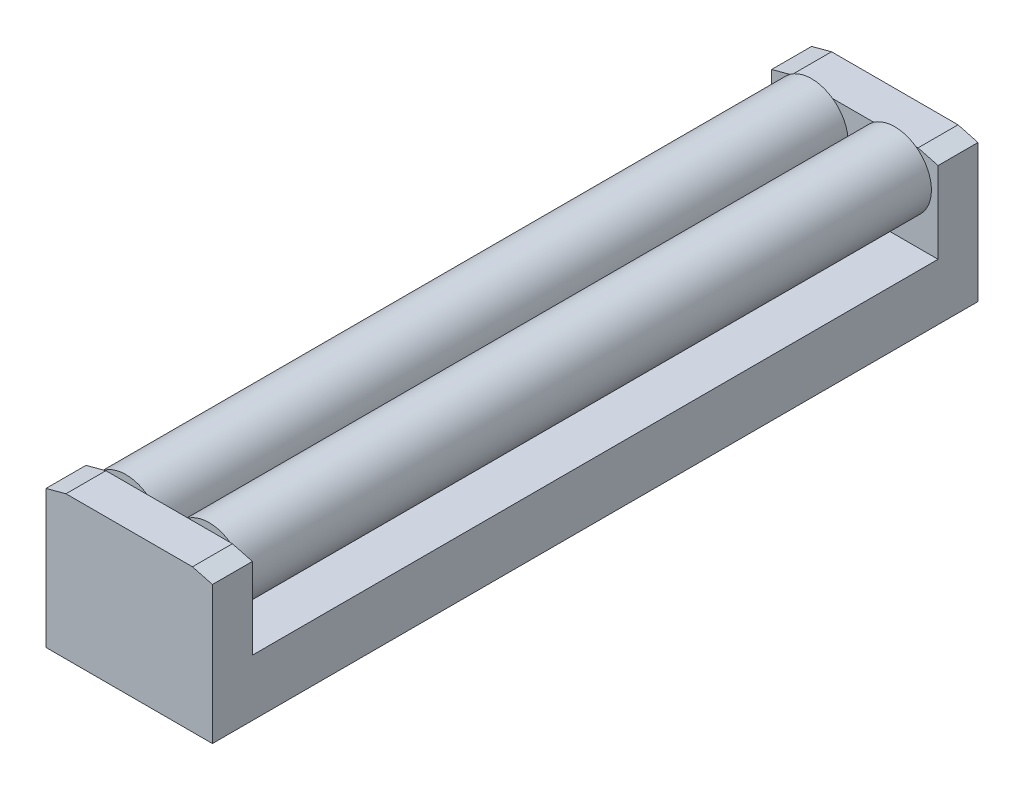
ISO-10303-21;
HEADER;
FILE_DESCRIPTION(('STEP AP214'),'2;1');
FILE_NAME('part.step','',(''),(''),'','','');
FILE_SCHEMA(('AUTOMOTIVE_DESIGN { 1 0 10303 214 1 1 1 1 }'));
ENDSEC;
DATA;
#1=APPLICATION_CONTEXT('core data for automotive mechanical design processes');
#2=APPLICATION_PROTOCOL_DEFINITION('international standard','automotive_design',2000,#1);
#3=PRODUCT_CONTEXT('',#1,'mechanical');
#4=PRODUCT('Part','Part','',(#3));
#5=PRODUCT_RELATED_PRODUCT_CATEGORY('part','',(#4));
#6=PRODUCT_DEFINITION_FORMATION('','',#4);
#7=PRODUCT_DEFINITION_CONTEXT('part definition',#1,'design');
#8=PRODUCT_DEFINITION('design','',#6,#7);
#9=PRODUCT_DEFINITION_SHAPE('','',#8);
#10=(LENGTH_UNIT() NAMED_UNIT(*) SI_UNIT(.MILLI.,.METRE.));
#11=(NAMED_UNIT(*) PLANE_ANGLE_UNIT() SI_UNIT($,.RADIAN.));
#12=(NAMED_UNIT(*) SI_UNIT($,.STERADIAN.) SOLID_ANGLE_UNIT());
#13=UNCERTAINTY_MEASURE_WITH_UNIT(LENGTH_MEASURE(1.E-05),#10,'distance_accuracy_value','');
#14=(GEOMETRIC_REPRESENTATION_CONTEXT(3) GLOBAL_UNCERTAINTY_ASSIGNED_CONTEXT((#13)) GLOBAL_UNIT_ASSIGNED_CONTEXT((#10,
#11,#12)) REPRESENTATION_CONTEXT('',''));
#15=CARTESIAN_POINT('',(0.,0.,0.));
#16=DIRECTION('',(0.,0.,1.));
#17=DIRECTION('',(1.,0.,0.));
#18=AXIS2_PLACEMENT_3D('',#15,#16,#17);
#19=CARTESIAN_POINT('',(-59.,32.1394616265751,109.));
#20=DIRECTION('',(0.,0.,1.));
#21=DIRECTION('',(1.,0.,0.));
#22=AXIS2_PLACEMENT_3D('',#19,#20,#21);
#23=PLANE('',#22);
#24=DIRECTION('',(-1.,0.,0.));
#25=VECTOR('',#24,1.);
#26=CARTESIAN_POINT('',(0.,21.5,109.));
#27=LINE('',#26,#25);
#28=CARTESIAN_POINT('',(21.9999999999999,21.5,109.));
#29=VERTEX_POINT('',#28);
#30=CARTESIAN_POINT('',(21.6622776601684,21.5,109.));
#31=VERTEX_POINT('',#30);
#32=EDGE_CURVE('E182',#29,#31,#27,.T.);
#33=ORIENTED_EDGE('',*,*,#32,.F.);
#34=DIRECTION('',(-0.965925826289069,0.258819045102519,0.));
#35=VECTOR('',#34,1.);
#36=CARTESIAN_POINT('',(22.,21.5,109.));
#37=LINE('',#36,#35);
#38=CARTESIAN_POINT('',(25.,20.6961524227066,109.));
#39=VERTEX_POINT('',#38);
#40=EDGE_CURVE('E229',#29,#39,#37,.F.);
#41=ORIENTED_EDGE('',*,*,#40,.T.);
#42=DIRECTION('',(0.,-1.,0.));
#43=VECTOR('',#42,1.);
#44=CARTESIAN_POINT('',(25.,32.139461626575,109.));
#45=LINE('',#44,#43);
#46=CARTESIAN_POINT('',(25.,8.5,109.));
#47=VERTEX_POINT('',#46);
#48=EDGE_CURVE('E337',#39,#47,#45,.T.);
#49=ORIENTED_EDGE('',*,*,#48,.T.);
#50=DIRECTION('',(1.,0.,0.));
#51=VECTOR('',#50,1.);
#52=CARTESIAN_POINT('',(-59.,8.50000000000004,109.));
#53=LINE('',#52,#51);
#54=CARTESIAN_POINT('',(0.,8.50000000000001,109.));
#55=VERTEX_POINT('',#54);
#56=EDGE_CURVE('E264',#55,#47,#53,.T.);
#57=ORIENTED_EDGE('',*,*,#56,.F.);
#58=DIRECTION('',(0.,-1.,0.));
#59=VECTOR('',#58,1.);
#60=CARTESIAN_POINT('',(0.,0.,109.));
#61=LINE('',#60,#59);
#62=CARTESIAN_POINT('',(0.,20.6961524227066,109.));
#63=VERTEX_POINT('',#62);
#64=EDGE_CURVE('E255',#63,#55,#61,.T.);
#65=ORIENTED_EDGE('',*,*,#64,.F.);
#66=DIRECTION('',(-0.965925826289069,-0.258819045102519,0.));
#67=VECTOR('',#66,1.);
#68=CARTESIAN_POINT('',(0.,20.6961524227066,109.));
#69=LINE('',#68,#67);
#70=CARTESIAN_POINT('',(2.74131560072419,21.4306857241195,109.));
#71=VERTEX_POINT('',#70);
#72=EDGE_CURVE('E226',#63,#71,#69,.F.);
#73=ORIENTED_EDGE('',*,*,#72,.T.);
#74=CARTESIAN_POINT('',(6.,17.,109.));
#75=DIRECTION('',(0.,0.,1.));
#76=DIRECTION('',(1.,0.,0.));
#77=AXIS2_PLACEMENT_3D('',#74,#75,#76);
#78=CIRCLE('',#77,5.5);
#79=CARTESIAN_POINT('',(9.16227766016838,21.5,109.));
#80=VERTEX_POINT('',#79);
#81=EDGE_CURVE('E344',#71,#80,#78,.T.);
#82=ORIENTED_EDGE('',*,*,#81,.T.);
#83=CARTESIAN_POINT('',(15.3377223398316,21.5,109.));
#84=VERTEX_POINT('',#83);
#85=EDGE_CURVE('E186',#84,#80,#27,.T.);
#86=ORIENTED_EDGE('',*,*,#85,.F.);
#87=CARTESIAN_POINT('',(18.5,17.,109.));
#88=DIRECTION('',(0.,0.,1.));
#89=DIRECTION('',(1.,0.,0.));
#90=AXIS2_PLACEMENT_3D('',#87,#88,#89);
#91=CIRCLE('',#90,5.5);
#92=EDGE_CURVE('E160',#84,#31,#91,.T.);
#93=ORIENTED_EDGE('',*,*,#92,.T.);
#94=EDGE_LOOP('',(#33,#41,#49,#57,#65,#73,#82,#86,#93));
#95=FACE_BOUND('',#94,.T.);
#96=ADVANCED_FACE('F34',(#95),#23,.F.);
#97=CARTESIAN_POINT('',(-59.,32.1394616265751,6.00000000000001));
#98=DIRECTION('',(0.,0.,-1.));
#99=DIRECTION('',(0.,1.,0.));
#100=AXIS2_PLACEMENT_3D('',#97,#98,#99);
#101=PLANE('',#100);
#102=CARTESIAN_POINT('',(6.,17.,6.00000000000001));
#103=DIRECTION('',(0.,0.,-1.));
#104=DIRECTION('',(0.,1.,0.));
#105=AXIS2_PLACEMENT_3D('',#102,#103,#104);
#106=CIRCLE('',#105,5.5);
#107=CARTESIAN_POINT('',(2.74131560072418,21.4306857241195,6.00000000000001));
#108=VERTEX_POINT('',#107);
#109=CARTESIAN_POINT('',(9.16227766016838,21.5,6.));
#110=VERTEX_POINT('',#109);
#111=EDGE_CURVE('E184',#108,#110,#106,.F.);
#112=ORIENTED_EDGE('',*,*,#111,.F.);
#113=DIRECTION('',(0.965925826289069,0.258819045102519,0.));
#114=VECTOR('',#113,1.);
#115=CARTESIAN_POINT('',(0.,20.6961524227066,6.00000000000001));
#116=LINE('',#115,#114);
#117=CARTESIAN_POINT('',(0.,20.6961524227066,6.00000000000001));
#118=VERTEX_POINT('',#117);
#119=EDGE_CURVE('E211',#108,#118,#116,.F.);
#120=ORIENTED_EDGE('',*,*,#119,.T.);
#121=DIRECTION('',(0.,1.,0.));
#122=VECTOR('',#121,1.);
#123=CARTESIAN_POINT('',(0.,0.,6.00000000000001));
#124=LINE('',#123,#122);
#125=CARTESIAN_POINT('',(0.,8.50000000000003,6.));
#126=VERTEX_POINT('',#125);
#127=EDGE_CURVE('E247',#126,#118,#124,.T.);
#128=ORIENTED_EDGE('',*,*,#127,.F.);
#129=DIRECTION('',(1.,0.,0.));
#130=VECTOR('',#129,1.);
#131=CARTESIAN_POINT('',(-59.,8.50000000000005,6.));
#132=LINE('',#131,#130);
#133=CARTESIAN_POINT('',(25.,8.50000000000001,6.));
#134=VERTEX_POINT('',#133);
#135=EDGE_CURVE('E256',#126,#134,#132,.T.);
#136=ORIENTED_EDGE('',*,*,#135,.T.);
#137=DIRECTION('',(0.,1.,0.));
#138=VECTOR('',#137,1.);
#139=CARTESIAN_POINT('',(25.,32.139461626575,6.00000000000001));
#140=LINE('',#139,#138);
#141=CARTESIAN_POINT('',(25.,20.6961524227066,6.));
#142=VERTEX_POINT('',#141);
#143=EDGE_CURVE('E327',#134,#142,#140,.T.);
#144=ORIENTED_EDGE('',*,*,#143,.T.);
#145=DIRECTION('',(0.965925826289069,-0.258819045102519,0.));
#146=VECTOR('',#145,1.);
#147=CARTESIAN_POINT('',(22.,21.5,6.00000000000001));
#148=LINE('',#147,#146);
#149=CARTESIAN_POINT('',(21.9999999999999,21.5,6.00000000000001));
#150=VERTEX_POINT('',#149);
#151=EDGE_CURVE('E208',#142,#150,#148,.F.);
#152=ORIENTED_EDGE('',*,*,#151,.T.);
#153=DIRECTION('',(1.,0.,0.));
#154=VECTOR('',#153,1.);
#155=CARTESIAN_POINT('',(0.,21.5,6.00000000000001));
#156=LINE('',#155,#154);
#157=CARTESIAN_POINT('',(21.6622776601684,21.5,6.00000000000001));
#158=VERTEX_POINT('',#157);
#159=EDGE_CURVE('E151',#158,#150,#156,.T.);
#160=ORIENTED_EDGE('',*,*,#159,.F.);
#161=CARTESIAN_POINT('',(18.5,17.,6.));
#162=DIRECTION('',(0.,0.,1.));
#163=DIRECTION('',(1.,0.,0.));
#164=AXIS2_PLACEMENT_3D('',#161,#162,#163);
#165=CIRCLE('',#164,5.5);
#166=CARTESIAN_POINT('',(15.3377223398316,21.5,6.));
#167=VERTEX_POINT('',#166);
#168=EDGE_CURVE('E157',#167,#158,#165,.T.);
#169=ORIENTED_EDGE('',*,*,#168,.F.);
#170=EDGE_CURVE('E150',#110,#167,#156,.T.);
#171=ORIENTED_EDGE('',*,*,#170,.F.);
#172=EDGE_LOOP('',(#112,#120,#128,#136,#144,#152,#160,#169,#171));
#173=FACE_BOUND('',#172,.T.);
#174=ADVANCED_FACE('F164',(#173),#101,.F.);
#175=CARTESIAN_POINT('',(0.,21.5,115.));
#176=DIRECTION('',(0.,-1.,0.));
#177=DIRECTION('',(0.,0.,-1.));
#178=AXIS2_PLACEMENT_3D('',#175,#176,#177);
#179=PLANE('',#178);
#180=DIRECTION('',(-1.,0.,0.));
#181=VECTOR('',#180,1.);
#182=CARTESIAN_POINT('',(0.,21.5,115.));
#183=LINE('',#182,#181);
#184=CARTESIAN_POINT('',(22.,21.5,115.));
#185=VERTEX_POINT('',#184);
#186=CARTESIAN_POINT('',(3.00000000000003,21.5,115.));
#187=VERTEX_POINT('',#186);
#188=EDGE_CURVE('E292',#185,#187,#183,.T.);
#189=ORIENTED_EDGE('',*,*,#188,.F.);
#190=DIRECTION('',(0.,0.,-1.));
#191=VECTOR('',#190,1.);
#192=CARTESIAN_POINT('',(22.,21.5,115.));
#193=LINE('',#192,#191);
#194=EDGE_CURVE('E222',#185,#29,#193,.T.);
#195=ORIENTED_EDGE('',*,*,#194,.T.);
#196=ORIENTED_EDGE('',*,*,#32,.T.);
#197=EDGE_CURVE('E185',#31,#84,#27,.T.);
#198=ORIENTED_EDGE('',*,*,#197,.T.);
#199=ORIENTED_EDGE('',*,*,#85,.T.);
#200=CARTESIAN_POINT('',(3.00000000000003,21.5,109.));
#201=VERTEX_POINT('',#200);
#202=EDGE_CURVE('E177',#80,#201,#27,.T.);
#203=ORIENTED_EDGE('',*,*,#202,.T.);
#204=DIRECTION('',(0.,0.,1.));
#205=VECTOR('',#204,1.);
#206=CARTESIAN_POINT('',(3.00000000000003,21.5,115.));
#207=LINE('',#206,#205);
#208=EDGE_CURVE('E219',#201,#187,#207,.T.);
#209=ORIENTED_EDGE('',*,*,#208,.T.);
#210=EDGE_LOOP('',(#189,#195,#196,#198,#199,#203,#209));
#211=FACE_BOUND('',#210,.T.);
#212=ADVANCED_FACE('F411',(#211),#179,.F.);
#213=CARTESIAN_POINT('',(0.,0.,115.));
#214=DIRECTION('',(1.,0.,0.));
#215=DIRECTION('',(0.,0.,-1.));
#216=AXIS2_PLACEMENT_3D('',#213,#214,#215);
#217=PLANE('',#216);
#218=ORIENTED_EDGE('',*,*,#127,.T.);
#219=DIRECTION('',(0.,0.,-1.));
#220=VECTOR('',#219,1.);
#221=CARTESIAN_POINT('',(0.,20.6961524227066,115.));
#222=LINE('',#221,#220);
#223=CARTESIAN_POINT('',(0.,20.6961524227066,0.));
#224=VERTEX_POINT('',#223);
#225=EDGE_CURVE('E193',#118,#224,#222,.T.);
#226=ORIENTED_EDGE('',*,*,#225,.T.);
#227=DIRECTION('',(0.,-1.,0.));
#228=VECTOR('',#227,1.);
#229=CARTESIAN_POINT('',(0.,0.,0.));
#230=LINE('',#229,#228);
#231=CARTESIAN_POINT('',(0.,0.,0.));
#232=VERTEX_POINT('',#231);
#233=EDGE_CURVE('E270',#224,#232,#230,.T.);
#234=ORIENTED_EDGE('',*,*,#233,.T.);
#235=DIRECTION('',(0.,0.,-1.));
#236=VECTOR('',#235,1.);
#237=CARTESIAN_POINT('',(0.,0.,115.));
#238=LINE('',#237,#236);
#239=CARTESIAN_POINT('',(0.,0.,115.));
#240=VERTEX_POINT('',#239);
#241=EDGE_CURVE('E180',#240,#232,#238,.T.);
#242=ORIENTED_EDGE('',*,*,#241,.F.);
#243=DIRECTION('',(0.,-1.,0.));
#244=VECTOR('',#243,1.);
#245=CARTESIAN_POINT('',(0.,0.,115.));
#246=LINE('',#245,#244);
#247=CARTESIAN_POINT('',(0.,20.6961524227066,115.));
#248=VERTEX_POINT('',#247);
#249=EDGE_CURVE('E282',#248,#240,#246,.T.);
#250=ORIENTED_EDGE('',*,*,#249,.F.);
#251=DIRECTION('',(0.,0.,-1.));
#252=VECTOR('',#251,1.);
#253=CARTESIAN_POINT('',(0.,20.6961524227066,115.));
#254=LINE('',#253,#252);
#255=EDGE_CURVE('E189',#248,#63,#254,.T.);
#256=ORIENTED_EDGE('',*,*,#255,.T.);
#257=ORIENTED_EDGE('',*,*,#64,.T.);
#258=DIRECTION('',(0.,0.,-1.));
#259=VECTOR('',#258,1.);
#260=CARTESIAN_POINT('',(0.,8.50000000000001,115.));
#261=LINE('',#260,#259);
#262=EDGE_CURVE('E253',#55,#126,#261,.T.);
#263=ORIENTED_EDGE('',*,*,#262,.T.);
#264=EDGE_LOOP('',(#218,#226,#234,#242,#250,#256,#257,#263));
#265=FACE_BOUND('',#264,.T.);
#266=ADVANCED_FACE('F36',(#265),#217,.F.);
#267=CARTESIAN_POINT('',(0.,0.,115.));
#268=DIRECTION('',(0.,1.,0.));
#269=DIRECTION('',(0.,0.,1.));
#270=AXIS2_PLACEMENT_3D('',#267,#268,#269);
#271=PLANE('',#270);
#272=CARTESIAN_POINT('',(12.,0.,9.50000000000001));
#273=DIRECTION('',(0.,-1.,0.));
#274=DIRECTION('',(0.,0.,-1.));
#275=AXIS2_PLACEMENT_3D('',#272,#273,#274);
#276=CIRCLE('',#275,3.);
#277=CARTESIAN_POINT('',(12.,0.,6.50000000000001));
#278=VERTEX_POINT('',#277);
#279=EDGE_CURVE('E360',#278,#278,#276,.T.);
#280=ORIENTED_EDGE('',*,*,#279,.F.);
#281=EDGE_LOOP('',(#280));
#282=FACE_BOUND('',#281,.T.);
#283=CARTESIAN_POINT('',(12.,0.,105.5));
#284=DIRECTION('',(0.,-1.,0.));
#285=DIRECTION('',(0.,0.,-1.));
#286=AXIS2_PLACEMENT_3D('',#283,#284,#285);
#287=CIRCLE('',#286,3.);
#288=CARTESIAN_POINT('',(12.,0.,102.5));
#289=VERTEX_POINT('',#288);
#290=EDGE_CURVE('E352',#289,#289,#287,.T.);
#291=ORIENTED_EDGE('',*,*,#290,.F.);
#292=EDGE_LOOP('',(#291));
#293=FACE_BOUND('',#292,.T.);
#294=DIRECTION('',(1.,0.,0.));
#295=VECTOR('',#294,1.);
#296=CARTESIAN_POINT('',(0.,0.,0.));
#297=LINE('',#296,#295);
#298=CARTESIAN_POINT('',(25.,0.,0.));
#299=VERTEX_POINT('',#298);
#300=EDGE_CURVE('E273',#232,#299,#297,.T.);
#301=ORIENTED_EDGE('',*,*,#300,.T.);
#302=DIRECTION('',(0.,0.,-1.));
#303=VECTOR('',#302,1.);
#304=CARTESIAN_POINT('',(25.,0.,115.));
#305=LINE('',#304,#303);
#306=CARTESIAN_POINT('',(25.,0.,115.));
#307=VERTEX_POINT('',#306);
#308=EDGE_CURVE('E295',#307,#299,#305,.T.);
#309=ORIENTED_EDGE('',*,*,#308,.F.);
#310=DIRECTION('',(1.,0.,0.));
#311=VECTOR('',#310,1.);
#312=CARTESIAN_POINT('',(0.,0.,115.));
#313=LINE('',#312,#311);
#314=EDGE_CURVE('E285',#240,#307,#313,.T.);
#315=ORIENTED_EDGE('',*,*,#314,.F.);
#316=ORIENTED_EDGE('',*,*,#241,.T.);
#317=EDGE_LOOP('',(#301,#309,#315,#316));
#318=FACE_BOUND('',#317,.T.);
#319=ADVANCED_FACE('F369',(#282,#293,#318),#271,.F.);
#320=CARTESIAN_POINT('',(25.,0.,115.));
#321=DIRECTION('',(-1.,0.,0.));
#322=DIRECTION('',(0.,0.,1.));
#323=AXIS2_PLACEMENT_3D('',#320,#321,#322);
#324=PLANE('',#323);
#325=DIRECTION('',(0.,1.,0.));
#326=VECTOR('',#325,1.);
#327=CARTESIAN_POINT('',(25.,0.,0.));
#328=LINE('',#327,#326);
#329=CARTESIAN_POINT('',(25.,20.6961524227066,0.));
#330=VERTEX_POINT('',#329);
#331=EDGE_CURVE('E276',#299,#330,#328,.T.);
#332=ORIENTED_EDGE('',*,*,#331,.T.);
#333=DIRECTION('',(0.,0.,1.));
#334=VECTOR('',#333,1.);
#335=CARTESIAN_POINT('',(25.,20.6961524227066,115.));
#336=LINE('',#335,#334);
#337=EDGE_CURVE('E216',#330,#142,#336,.T.);
#338=ORIENTED_EDGE('',*,*,#337,.T.);
#339=ORIENTED_EDGE('',*,*,#143,.F.);
#340=DIRECTION('',(0.,0.,-1.));
#341=VECTOR('',#340,1.);
#342=CARTESIAN_POINT('',(25.,8.5,109.));
#343=LINE('',#342,#341);
#344=EDGE_CURVE('E330',#47,#134,#343,.T.);
#345=ORIENTED_EDGE('',*,*,#344,.F.);
#346=ORIENTED_EDGE('',*,*,#48,.F.);
#347=DIRECTION('',(0.,0.,1.));
#348=VECTOR('',#347,1.);
#349=CARTESIAN_POINT('',(25.,20.6961524227066,115.));
#350=LINE('',#349,#348);
#351=CARTESIAN_POINT('',(25.,20.6961524227066,115.));
#352=VERTEX_POINT('',#351);
#353=EDGE_CURVE('E213',#39,#352,#350,.T.);
#354=ORIENTED_EDGE('',*,*,#353,.T.);
#355=DIRECTION('',(0.,1.,0.));
#356=VECTOR('',#355,1.);
#357=CARTESIAN_POINT('',(25.,0.,115.));
#358=LINE('',#357,#356);
#359=EDGE_CURVE('E288',#307,#352,#358,.T.);
#360=ORIENTED_EDGE('',*,*,#359,.F.);
#361=ORIENTED_EDGE('',*,*,#308,.T.);
#362=EDGE_LOOP('',(#332,#338,#339,#345,#346,#354,#360,#361));
#363=FACE_BOUND('',#362,.T.);
#364=ADVANCED_FACE('F323',(#363),#324,.F.);
#365=DIRECTION('',(-1.,0.,0.));
#366=VECTOR('',#365,1.);
#367=CARTESIAN_POINT('',(0.,21.5,0.));
#368=LINE('',#367,#366);
#369=CARTESIAN_POINT('',(22.,21.5,0.));
#370=VERTEX_POINT('',#369);
#371=CARTESIAN_POINT('',(3.00000000000003,21.5,0.));
#372=VERTEX_POINT('',#371);
#373=EDGE_CURVE('E280',#370,#372,#368,.T.);
#374=ORIENTED_EDGE('',*,*,#373,.T.);
#375=DIRECTION('',(0.,0.,1.));
#376=VECTOR('',#375,1.);
#377=CARTESIAN_POINT('',(3.00000000000003,21.5,115.));
#378=LINE('',#377,#376);
#379=CARTESIAN_POINT('',(3.00000000000003,21.5,6.00000000000001));
#380=VERTEX_POINT('',#379);
#381=EDGE_CURVE('E205',#372,#380,#378,.T.);
#382=ORIENTED_EDGE('',*,*,#381,.T.);
#383=EDGE_CURVE('E171',#380,#110,#156,.T.);
#384=ORIENTED_EDGE('',*,*,#383,.T.);
#385=ORIENTED_EDGE('',*,*,#170,.T.);
#386=EDGE_CURVE('E141',#167,#158,#156,.T.);
#387=ORIENTED_EDGE('',*,*,#386,.T.);
#388=ORIENTED_EDGE('',*,*,#159,.T.);
#389=DIRECTION('',(0.,0.,-1.));
#390=VECTOR('',#389,1.);
#391=CARTESIAN_POINT('',(22.,21.5,115.));
#392=LINE('',#391,#390);
#393=EDGE_CURVE('E201',#150,#370,#392,.T.);
#394=ORIENTED_EDGE('',*,*,#393,.T.);
#395=EDGE_LOOP('',(#374,#382,#384,#385,#387,#388,#394));
#396=FACE_BOUND('',#395,.T.);
#397=ADVANCED_FACE('F169',(#396),#179,.F.);
#398=CARTESIAN_POINT('',(0.,21.5,115.));
#399=DIRECTION('',(0.,0.,-1.));
#400=DIRECTION('',(-1.,0.,0.));
#401=AXIS2_PLACEMENT_3D('',#398,#399,#400);
#402=PLANE('',#401);
#403=ORIENTED_EDGE('',*,*,#359,.T.);
#404=DIRECTION('',(0.965925826289069,-0.258819045102519,0.));
#405=VECTOR('',#404,1.);
#406=CARTESIAN_POINT('',(22.,21.5,115.));
#407=LINE('',#406,#405);
#408=EDGE_CURVE('E235',#352,#185,#407,.F.);
#409=ORIENTED_EDGE('',*,*,#408,.T.);
#410=ORIENTED_EDGE('',*,*,#188,.T.);
#411=DIRECTION('',(0.965925826289069,0.258819045102519,0.));
#412=VECTOR('',#411,1.);
#413=CARTESIAN_POINT('',(0.,20.6961524227066,115.));
#414=LINE('',#413,#412);
#415=EDGE_CURVE('E232',#187,#248,#414,.F.);
#416=ORIENTED_EDGE('',*,*,#415,.T.);
#417=ORIENTED_EDGE('',*,*,#249,.T.);
#418=ORIENTED_EDGE('',*,*,#314,.T.);
#419=EDGE_LOOP('',(#403,#409,#410,#416,#417,#418));
#420=FACE_BOUND('',#419,.T.);
#421=ADVANCED_FACE('F432',(#420),#402,.F.);
#422=CARTESIAN_POINT('',(0.,21.5,0.));
#423=DIRECTION('',(0.,0.,-1.));
#424=DIRECTION('',(-1.,0.,0.));
#425=AXIS2_PLACEMENT_3D('',#422,#423,#424);
#426=PLANE('',#425);
#427=ORIENTED_EDGE('',*,*,#233,.F.);
#428=DIRECTION('',(-0.965925826289069,-0.258819045102519,0.));
#429=VECTOR('',#428,1.);
#430=CARTESIAN_POINT('',(0.200961894323341,20.75,0.));
#431=LINE('',#430,#429);
#432=EDGE_CURVE('E199',#224,#372,#431,.F.);
#433=ORIENTED_EDGE('',*,*,#432,.T.);
#434=ORIENTED_EDGE('',*,*,#373,.F.);
#435=DIRECTION('',(-0.965925826289069,0.258819045102519,0.));
#436=VECTOR('',#435,1.);
#437=CARTESIAN_POINT('',(1.47372055837115,26.9999999999999,0.));
#438=LINE('',#437,#436);
#439=EDGE_CURVE('E197',#370,#330,#438,.F.);
#440=ORIENTED_EDGE('',*,*,#439,.T.);
#441=ORIENTED_EDGE('',*,*,#331,.F.);
#442=ORIENTED_EDGE('',*,*,#300,.F.);
#443=EDGE_LOOP('',(#427,#433,#434,#440,#441,#442));
#444=FACE_BOUND('',#443,.T.);
#445=ADVANCED_FACE('F321',(#444),#426,.T.);
#446=CARTESIAN_POINT('',(-59.,8.50000000000004,109.));
#447=DIRECTION('',(0.,-1.,0.));
#448=DIRECTION('',(1.,0.,0.));
#449=AXIS2_PLACEMENT_3D('',#446,#447,#448);
#450=PLANE('',#449);
#451=CARTESIAN_POINT('',(12.,8.50000000000002,9.50000000000001));
#452=DIRECTION('',(0.,-1.,0.));
#453=DIRECTION('',(1.,0.,0.));
#454=AXIS2_PLACEMENT_3D('',#451,#452,#453);
#455=CIRCLE('',#454,3.);
#456=CARTESIAN_POINT('',(15.,8.50000000000002,9.50000000000001));
#457=VERTEX_POINT('',#456);
#458=EDGE_CURVE('E356',#457,#457,#455,.F.);
#459=ORIENTED_EDGE('',*,*,#458,.F.);
#460=EDGE_LOOP('',(#459));
#461=FACE_BOUND('',#460,.T.);
#462=CARTESIAN_POINT('',(12.,8.50000000000001,105.5));
#463=DIRECTION('',(0.,-1.,0.));
#464=DIRECTION('',(1.,0.,0.));
#465=AXIS2_PLACEMENT_3D('',#462,#463,#464);
#466=CIRCLE('',#465,3.);
#467=CARTESIAN_POINT('',(15.,8.50000000000001,105.5));
#468=VERTEX_POINT('',#467);
#469=EDGE_CURVE('E166',#468,#468,#466,.F.);
#470=ORIENTED_EDGE('',*,*,#469,.F.);
#471=EDGE_LOOP('',(#470));
#472=FACE_BOUND('',#471,.T.);
#473=ORIENTED_EDGE('',*,*,#56,.T.);
#474=ORIENTED_EDGE('',*,*,#344,.T.);
#475=ORIENTED_EDGE('',*,*,#135,.F.);
#476=ORIENTED_EDGE('',*,*,#262,.F.);
#477=EDGE_LOOP('',(#473,#474,#475,#476));
#478=FACE_BOUND('',#477,.T.);
#479=ADVANCED_FACE('F450',(#461,#472,#478),#450,.F.);
#480=CARTESIAN_POINT('',(-59.,32.1394616265751,109.));
#481=DIRECTION('',(0.,0.,1.));
#482=DIRECTION('',(1.,0.,0.));
#483=AXIS2_PLACEMENT_3D('',#480,#481,#482);
#484=PLANE('',#483);
#485=ORIENTED_EDGE('',*,*,#202,.F.);
#486=EDGE_CURVE('E342',#80,#71,#78,.T.);
#487=ORIENTED_EDGE('',*,*,#486,.T.);
#488=DIRECTION('',(-0.965925826289069,-0.258819045102519,0.));
#489=VECTOR('',#488,1.);
#490=CARTESIAN_POINT('',(0.,20.6961524227066,109.));
#491=LINE('',#490,#489);
#492=EDGE_CURVE('E11',#71,#201,#491,.F.);
#493=ORIENTED_EDGE('',*,*,#492,.T.);
#494=EDGE_LOOP('',(#485,#487,#493));
#495=FACE_BOUND('',#494,.T.);
#496=ADVANCED_FACE('F456',(#495),#484,.T.);
#497=CARTESIAN_POINT('',(6.,17.,6.));
#498=DIRECTION('',(0.,0.,1.));
#499=DIRECTION('',(1.,0.,0.));
#500=AXIS2_PLACEMENT_3D('',#497,#498,#499);
#501=PLANE('',#500);
#502=CARTESIAN_POINT('',(6.,17.,6.));
#503=DIRECTION('',(0.,0.,1.));
#504=DIRECTION('',(1.,0.,0.));
#505=AXIS2_PLACEMENT_3D('',#502,#503,#504);
#506=CIRCLE('',#505,5.5);
#507=EDGE_CURVE('E48',#110,#108,#506,.T.);
#508=ORIENTED_EDGE('',*,*,#507,.F.);
#509=ORIENTED_EDGE('',*,*,#383,.F.);
#510=DIRECTION('',(0.965925826289069,0.258819045102519,0.));
#511=VECTOR('',#510,1.);
#512=CARTESIAN_POINT('',(4.67403810567667,21.948557158515,6.));
#513=LINE('',#512,#511);
#514=EDGE_CURVE('E43',#380,#108,#513,.F.);
#515=ORIENTED_EDGE('',*,*,#514,.T.);
#516=EDGE_LOOP('',(#508,#509,#515));
#517=FACE_BOUND('',#516,.T.);
#518=ADVANCED_FACE('F241',(#517),#501,.F.);
#519=CARTESIAN_POINT('',(6.,17.,124.556349186104));
#520=DIRECTION('',(0.,0.,-1.));
#521=DIRECTION('',(-1.,0.,0.));
#522=AXIS2_PLACEMENT_3D('',#519,#520,#521);
#523=CYLINDRICAL_SURFACE('',#522,5.5);
#524=ORIENTED_EDGE('',*,*,#507,.T.);
#525=ORIENTED_EDGE('',*,*,#111,.T.);
#526=EDGE_LOOP('',(#524,#525));
#527=FACE_BOUND('',#526,.T.);
#528=ORIENTED_EDGE('',*,*,#486,.F.);
#529=ORIENTED_EDGE('',*,*,#81,.F.);
#530=EDGE_LOOP('',(#528,#529));
#531=FACE_BOUND('',#530,.T.);
#532=ADVANCED_FACE('F390',(#527,#531),#523,.T.);
#533=CARTESIAN_POINT('',(-59.,32.1394616265751,109.));
#534=DIRECTION('',(0.,0.,1.));
#535=DIRECTION('',(1.,0.,0.));
#536=AXIS2_PLACEMENT_3D('',#533,#534,#535);
#537=PLANE('',#536);
#538=ORIENTED_EDGE('',*,*,#197,.F.);
#539=EDGE_CURVE('E347',#31,#84,#91,.T.);
#540=ORIENTED_EDGE('',*,*,#539,.T.);
#541=EDGE_LOOP('',(#538,#540));
#542=FACE_BOUND('',#541,.T.);
#543=ADVANCED_FACE('F479',(#542),#537,.T.);
#544=CARTESIAN_POINT('',(18.5,17.,6.));
#545=DIRECTION('',(0.,0.,1.));
#546=DIRECTION('',(1.,0.,0.));
#547=AXIS2_PLACEMENT_3D('',#544,#545,#546);
#548=PLANE('',#547);
#549=EDGE_CURVE('E144',#158,#167,#165,.T.);
#550=ORIENTED_EDGE('',*,*,#549,.F.);
#551=ORIENTED_EDGE('',*,*,#386,.F.);
#552=EDGE_LOOP('',(#550,#551));
#553=FACE_BOUND('',#552,.T.);
#554=ADVANCED_FACE('F143',(#553),#548,.F.);
#555=CARTESIAN_POINT('',(18.5,17.,124.556349186104));
#556=DIRECTION('',(0.,0.,-1.));
#557=DIRECTION('',(-1.,0.,0.));
#558=AXIS2_PLACEMENT_3D('',#555,#556,#557);
#559=CYLINDRICAL_SURFACE('',#558,5.5);
#560=ORIENTED_EDGE('',*,*,#549,.T.);
#561=ORIENTED_EDGE('',*,*,#168,.T.);
#562=EDGE_LOOP('',(#560,#561));
#563=FACE_BOUND('',#562,.T.);
#564=ORIENTED_EDGE('',*,*,#539,.F.);
#565=ORIENTED_EDGE('',*,*,#92,.F.);
#566=EDGE_LOOP('',(#564,#565));
#567=FACE_BOUND('',#566,.T.);
#568=ADVANCED_FACE('F155',(#563,#567),#559,.T.);
#569=CARTESIAN_POINT('',(0.,20.6961524227066,115.));
#570=DIRECTION('',(0.258819045102519,-0.965925826289069,0.));
#571=DIRECTION('',(0.965925826289069,0.258819045102519,0.));
#572=AXIS2_PLACEMENT_3D('',#569,#570,#571);
#573=PLANE('',#572);
#574=ORIENTED_EDGE('',*,*,#514,.F.);
#575=ORIENTED_EDGE('',*,*,#381,.F.);
#576=ORIENTED_EDGE('',*,*,#432,.F.);
#577=ORIENTED_EDGE('',*,*,#225,.F.);
#578=ORIENTED_EDGE('',*,*,#119,.F.);
#579=EDGE_LOOP('',(#574,#575,#576,#577,#578));
#580=FACE_BOUND('',#579,.T.);
#581=ADVANCED_FACE('F245',(#580),#573,.F.);
#582=CARTESIAN_POINT('',(22.,21.5,115.));
#583=DIRECTION('',(-0.258819045102519,-0.965925826289069,0.));
#584=DIRECTION('',(0.965925826289069,-0.258819045102519,0.));
#585=AXIS2_PLACEMENT_3D('',#582,#583,#584);
#586=PLANE('',#585);
#587=ORIENTED_EDGE('',*,*,#151,.F.);
#588=ORIENTED_EDGE('',*,*,#337,.F.);
#589=ORIENTED_EDGE('',*,*,#439,.F.);
#590=ORIENTED_EDGE('',*,*,#393,.F.);
#591=EDGE_LOOP('',(#587,#588,#589,#590));
#592=FACE_BOUND('',#591,.T.);
#593=ADVANCED_FACE('F318',(#592),#586,.F.);
#594=CARTESIAN_POINT('',(22.,21.5,115.));
#595=DIRECTION('',(-0.258819045102519,-0.965925826289069,0.));
#596=DIRECTION('',(0.965925826289069,-0.258819045102519,0.));
#597=AXIS2_PLACEMENT_3D('',#594,#595,#596);
#598=PLANE('',#597);
#599=ORIENTED_EDGE('',*,*,#408,.F.);
#600=ORIENTED_EDGE('',*,*,#353,.F.);
#601=ORIENTED_EDGE('',*,*,#40,.F.);
#602=ORIENTED_EDGE('',*,*,#194,.F.);
#603=EDGE_LOOP('',(#599,#600,#601,#602));
#604=FACE_BOUND('',#603,.T.);
#605=ADVANCED_FACE('F530',(#604),#598,.F.);
#606=CARTESIAN_POINT('',(0.,20.6961524227066,115.));
#607=DIRECTION('',(0.258819045102519,-0.965925826289069,0.));
#608=DIRECTION('',(0.965925826289069,0.258819045102519,0.));
#609=AXIS2_PLACEMENT_3D('',#606,#607,#608);
#610=PLANE('',#609);
#611=ORIENTED_EDGE('',*,*,#415,.F.);
#612=ORIENTED_EDGE('',*,*,#208,.F.);
#613=ORIENTED_EDGE('',*,*,#492,.F.);
#614=ORIENTED_EDGE('',*,*,#72,.F.);
#615=ORIENTED_EDGE('',*,*,#255,.F.);
#616=EDGE_LOOP('',(#611,#612,#613,#614,#615));
#617=FACE_BOUND('',#616,.T.);
#618=ADVANCED_FACE('F379',(#617),#610,.F.);
#619=CARTESIAN_POINT('',(12.,16.9852813742386,105.5));
#620=DIRECTION('',(0.,-1.,0.));
#621=DIRECTION('',(0.,0.,-1.));
#622=AXIS2_PLACEMENT_3D('',#619,#620,#621);
#623=CYLINDRICAL_SURFACE('',#622,3.);
#624=ORIENTED_EDGE('',*,*,#469,.T.);
#625=EDGE_LOOP('',(#624));
#626=FACE_BOUND('',#625,.T.);
#627=ORIENTED_EDGE('',*,*,#290,.T.);
#628=EDGE_LOOP('',(#627));
#629=FACE_BOUND('',#628,.T.);
#630=ADVANCED_FACE('F537',(#626,#629),#623,.F.);
#631=CARTESIAN_POINT('',(12.,16.9852813742386,9.50000000000001));
#632=DIRECTION('',(0.,-1.,0.));
#633=DIRECTION('',(0.,0.,-1.));
#634=AXIS2_PLACEMENT_3D('',#631,#632,#633);
#635=CYLINDRICAL_SURFACE('',#634,3.);
#636=ORIENTED_EDGE('',*,*,#458,.T.);
#637=EDGE_LOOP('',(#636));
#638=FACE_BOUND('',#637,.T.);
#639=ORIENTED_EDGE('',*,*,#279,.T.);
#640=EDGE_LOOP('',(#639));
#641=FACE_BOUND('',#640,.T.);
#642=ADVANCED_FACE('F367',(#638,#641),#635,.F.);
#643=CLOSED_SHELL('',(#96,#174,#212,#266,#319,#364,#397,#421,#445,#479,#496,#518,#532,#543,#554,
#568,#581,#593,#605,#618,#630,#642));
#644=MANIFOLD_SOLID_BREP('B2',#643);
#645=ADVANCED_BREP_SHAPE_REPRESENTATION('',(#18,#644),#14);
#646=SHAPE_DEFINITION_REPRESENTATION(#9,#645);
ENDSEC;
END-ISO-10303-21;
